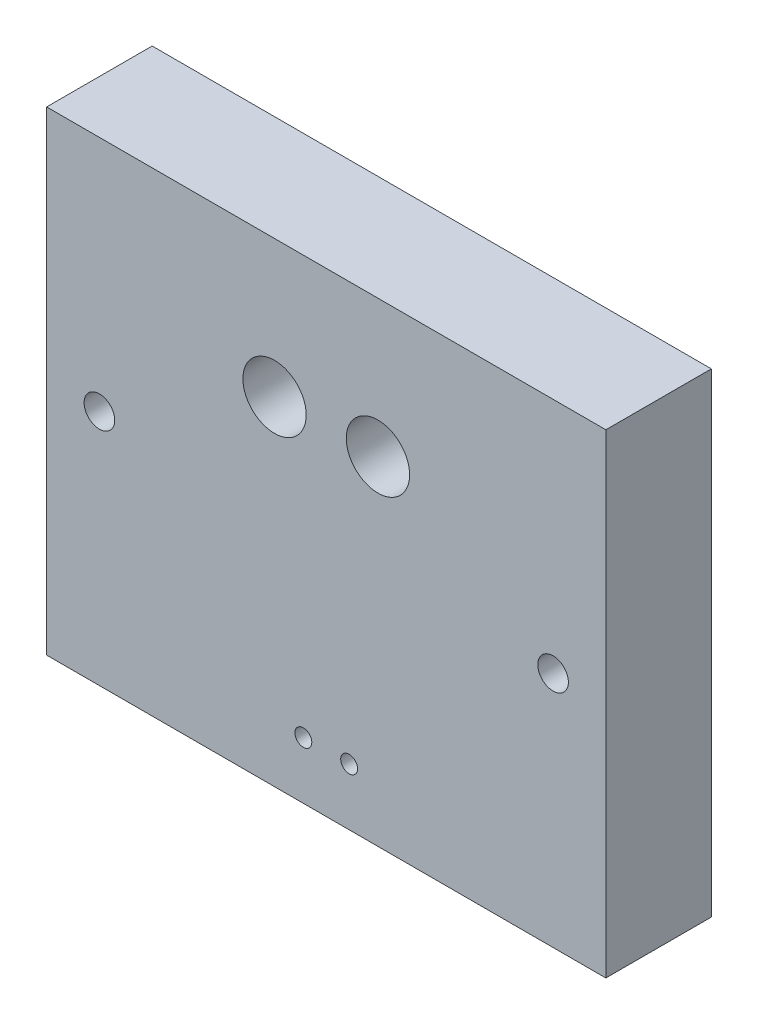
ISO-10303-21;
HEADER;
FILE_DESCRIPTION(('STEP AP214'),'2;1');
FILE_NAME('part.step','',(''),(''),'','','');
FILE_SCHEMA(('AUTOMOTIVE_DESIGN { 1 0 10303 214 1 1 1 1 }'));
ENDSEC;
DATA;
#1=APPLICATION_CONTEXT('core data for automotive mechanical design processes');
#2=APPLICATION_PROTOCOL_DEFINITION('international standard','automotive_design',2000,#1);
#3=PRODUCT_CONTEXT('',#1,'mechanical');
#4=PRODUCT('Part','Part','',(#3));
#5=PRODUCT_RELATED_PRODUCT_CATEGORY('part','',(#4));
#6=PRODUCT_DEFINITION_FORMATION('','',#4);
#7=PRODUCT_DEFINITION_CONTEXT('part definition',#1,'design');
#8=PRODUCT_DEFINITION('design','',#6,#7);
#9=PRODUCT_DEFINITION_SHAPE('','',#8);
#10=(LENGTH_UNIT() NAMED_UNIT(*) SI_UNIT(.MILLI.,.METRE.));
#11=(NAMED_UNIT(*) PLANE_ANGLE_UNIT() SI_UNIT($,.RADIAN.));
#12=(NAMED_UNIT(*) SI_UNIT($,.STERADIAN.) SOLID_ANGLE_UNIT());
#13=UNCERTAINTY_MEASURE_WITH_UNIT(LENGTH_MEASURE(1.E-05),#10,'distance_accuracy_value','');
#14=(GEOMETRIC_REPRESENTATION_CONTEXT(3) GLOBAL_UNCERTAINTY_ASSIGNED_CONTEXT((#13)) GLOBAL_UNIT_ASSIGNED_CONTEXT((#10,
#11,#12)) REPRESENTATION_CONTEXT('',''));
#15=CARTESIAN_POINT('',(0.,0.,0.));
#16=DIRECTION('',(0.,0.,1.));
#17=DIRECTION('',(1.,0.,0.));
#18=AXIS2_PLACEMENT_3D('',#15,#16,#17);
#19=CARTESIAN_POINT('',(3.55665672712301,6.70116618075802,0.));
#20=DIRECTION('',(0.,0.,1.));
#21=DIRECTION('',(1.,0.,0.));
#22=AXIS2_PLACEMENT_3D('',#19,#20,#21);
#23=CYLINDRICAL_SURFACE('',#22,1.45);
#24=CARTESIAN_POINT('',(3.55665672712301,6.70116618075802,0.));
#25=DIRECTION('',(0.,0.,1.));
#26=DIRECTION('',(1.,0.,0.));
#27=AXIS2_PLACEMENT_3D('',#24,#25,#26);
#28=CIRCLE('',#27,1.45);
#29=CARTESIAN_POINT('',(5.00665672712301,6.70116618075802,0.));
#30=VERTEX_POINT('',#29);
#31=EDGE_CURVE('E140',#30,#30,#28,.T.);
#32=ORIENTED_EDGE('',*,*,#31,.F.);
#33=EDGE_LOOP('',(#32));
#34=FACE_BOUND('',#33,.T.);
#35=CARTESIAN_POINT('',(3.55665672712301,6.70116618075802,5.));
#36=DIRECTION('',(0.,0.,1.));
#37=DIRECTION('',(1.,0.,0.));
#38=AXIS2_PLACEMENT_3D('',#35,#36,#37);
#39=CIRCLE('',#38,1.45);
#40=CARTESIAN_POINT('',(5.00665672712301,6.70116618075802,5.));
#41=VERTEX_POINT('',#40);
#42=EDGE_CURVE('E49',#41,#41,#39,.F.);
#43=ORIENTED_EDGE('',*,*,#42,.F.);
#44=EDGE_LOOP('',(#43));
#45=FACE_BOUND('',#44,.T.);
#46=ADVANCED_FACE('F45',(#34,#45),#23,.F.);
#47=CARTESIAN_POINT('',(13.356656727123,6.70116618075802,0.));
#48=DIRECTION('',(0.,0.,1.));
#49=DIRECTION('',(1.,0.,0.));
#50=AXIS2_PLACEMENT_3D('',#47,#48,#49);
#51=CYLINDRICAL_SURFACE('',#50,1.45);
#52=CARTESIAN_POINT('',(13.356656727123,6.70116618075802,0.));
#53=DIRECTION('',(0.,0.,1.));
#54=DIRECTION('',(1.,0.,0.));
#55=AXIS2_PLACEMENT_3D('',#52,#53,#54);
#56=CIRCLE('',#55,1.45);
#57=CARTESIAN_POINT('',(14.806656727123,6.70116618075802,0.));
#58=VERTEX_POINT('',#57);
#59=EDGE_CURVE('E162',#58,#58,#56,.T.);
#60=ORIENTED_EDGE('',*,*,#59,.F.);
#61=EDGE_LOOP('',(#60));
#62=FACE_BOUND('',#61,.T.);
#63=CARTESIAN_POINT('',(13.356656727123,6.70116618075802,5.));
#64=DIRECTION('',(0.,0.,1.));
#65=DIRECTION('',(1.,0.,0.));
#66=AXIS2_PLACEMENT_3D('',#63,#64,#65);
#67=CIRCLE('',#66,1.45);
#68=CARTESIAN_POINT('',(14.806656727123,6.70116618075802,5.));
#69=VERTEX_POINT('',#68);
#70=EDGE_CURVE('E131',#69,#69,#67,.F.);
#71=ORIENTED_EDGE('',*,*,#70,.F.);
#72=EDGE_LOOP('',(#71));
#73=FACE_BOUND('',#72,.T.);
#74=ADVANCED_FACE('F211',(#62,#73),#51,.F.);
#75=CARTESIAN_POINT('',(-18.043343272877,-25.298833819242,10.));
#76=DIRECTION('',(1.,0.,0.));
#77=DIRECTION('',(0.,0.,-1.));
#78=AXIS2_PLACEMENT_3D('',#75,#76,#77);
#79=PLANE('',#78);
#80=DIRECTION('',(0.,-1.,0.));
#81=VECTOR('',#80,1.);
#82=CARTESIAN_POINT('',(-18.043343272877,-25.298833819242,0.));
#83=LINE('',#82,#81);
#84=CARTESIAN_POINT('',(-18.043343272877,19.701166180758,0.));
#85=VERTEX_POINT('',#84);
#86=CARTESIAN_POINT('',(-18.043343272877,-25.298833819242,0.));
#87=VERTEX_POINT('',#86);
#88=EDGE_CURVE('E117',#85,#87,#83,.T.);
#89=ORIENTED_EDGE('',*,*,#88,.T.);
#90=DIRECTION('',(0.,0.,-1.));
#91=VECTOR('',#90,1.);
#92=CARTESIAN_POINT('',(-18.043343272877,-25.298833819242,10.));
#93=LINE('',#92,#91);
#94=CARTESIAN_POINT('',(-18.043343272877,-25.298833819242,10.));
#95=VERTEX_POINT('',#94);
#96=EDGE_CURVE('E11',#95,#87,#93,.T.);
#97=ORIENTED_EDGE('',*,*,#96,.F.);
#98=DIRECTION('',(0.,-1.,0.));
#99=VECTOR('',#98,1.);
#100=CARTESIAN_POINT('',(-18.043343272877,-25.298833819242,10.));
#101=LINE('',#100,#99);
#102=CARTESIAN_POINT('',(-18.043343272877,19.701166180758,10.));
#103=VERTEX_POINT('',#102);
#104=EDGE_CURVE('E100',#103,#95,#101,.T.);
#105=ORIENTED_EDGE('',*,*,#104,.F.);
#106=DIRECTION('',(0.,0.,-1.));
#107=VECTOR('',#106,1.);
#108=CARTESIAN_POINT('',(-18.043343272877,19.701166180758,10.));
#109=LINE('',#108,#107);
#110=EDGE_CURVE('E113',#103,#85,#109,.T.);
#111=ORIENTED_EDGE('',*,*,#110,.T.);
#112=EDGE_LOOP('',(#89,#97,#105,#111));
#113=FACE_BOUND('',#112,.T.);
#114=ADVANCED_FACE('F47',(#113),#79,.F.);
#115=CARTESIAN_POINT('',(-18.043343272877,-25.298833819242,10.));
#116=DIRECTION('',(0.,1.,0.));
#117=DIRECTION('',(0.,0.,1.));
#118=AXIS2_PLACEMENT_3D('',#115,#116,#117);
#119=PLANE('',#118);
#120=DIRECTION('',(1.,0.,0.));
#121=VECTOR('',#120,1.);
#122=CARTESIAN_POINT('',(-18.043343272877,-25.298833819242,0.));
#123=LINE('',#122,#121);
#124=CARTESIAN_POINT('',(34.956656727123,-25.298833819242,0.));
#125=VERTEX_POINT('',#124);
#126=EDGE_CURVE('E105',#87,#125,#123,.T.);
#127=ORIENTED_EDGE('',*,*,#126,.T.);
#128=DIRECTION('',(0.,0.,-1.));
#129=VECTOR('',#128,1.);
#130=CARTESIAN_POINT('',(34.956656727123,-25.298833819242,10.));
#131=LINE('',#130,#129);
#132=CARTESIAN_POINT('',(34.956656727123,-25.298833819242,10.));
#133=VERTEX_POINT('',#132);
#134=EDGE_CURVE('E56',#133,#125,#131,.T.);
#135=ORIENTED_EDGE('',*,*,#134,.F.);
#136=DIRECTION('',(1.,0.,0.));
#137=VECTOR('',#136,1.);
#138=CARTESIAN_POINT('',(-18.043343272877,-25.298833819242,10.));
#139=LINE('',#138,#137);
#140=EDGE_CURVE('E95',#95,#133,#139,.T.);
#141=ORIENTED_EDGE('',*,*,#140,.F.);
#142=ORIENTED_EDGE('',*,*,#96,.T.);
#143=EDGE_LOOP('',(#127,#135,#141,#142));
#144=FACE_BOUND('',#143,.T.);
#145=ADVANCED_FACE('F104',(#144),#119,.F.);
#146=CARTESIAN_POINT('',(34.956656727123,-25.298833819242,10.));
#147=DIRECTION('',(-1.,0.,0.));
#148=DIRECTION('',(0.,-1.,0.));
#149=AXIS2_PLACEMENT_3D('',#146,#147,#148);
#150=PLANE('',#149);
#151=DIRECTION('',(0.,1.,0.));
#152=VECTOR('',#151,1.);
#153=CARTESIAN_POINT('',(34.956656727123,-25.298833819242,0.));
#154=LINE('',#153,#152);
#155=CARTESIAN_POINT('',(34.956656727123,19.701166180758,0.));
#156=VERTEX_POINT('',#155);
#157=EDGE_CURVE('E82',#125,#156,#154,.T.);
#158=ORIENTED_EDGE('',*,*,#157,.T.);
#159=DIRECTION('',(0.,0.,-1.));
#160=VECTOR('',#159,1.);
#161=CARTESIAN_POINT('',(34.956656727123,19.701166180758,10.));
#162=LINE('',#161,#160);
#163=CARTESIAN_POINT('',(34.956656727123,19.701166180758,10.));
#164=VERTEX_POINT('',#163);
#165=EDGE_CURVE('E107',#164,#156,#162,.T.);
#166=ORIENTED_EDGE('',*,*,#165,.F.);
#167=DIRECTION('',(0.,1.,0.));
#168=VECTOR('',#167,1.);
#169=CARTESIAN_POINT('',(34.956656727123,-25.298833819242,10.));
#170=LINE('',#169,#168);
#171=EDGE_CURVE('E98',#133,#164,#170,.T.);
#172=ORIENTED_EDGE('',*,*,#171,.F.);
#173=ORIENTED_EDGE('',*,*,#134,.T.);
#174=EDGE_LOOP('',(#158,#166,#172,#173));
#175=FACE_BOUND('',#174,.T.);
#176=ADVANCED_FACE('F109',(#175),#150,.F.);
#177=CARTESIAN_POINT('',(-18.043343272877,19.701166180758,10.));
#178=DIRECTION('',(0.,-1.,0.));
#179=DIRECTION('',(0.,0.,-1.));
#180=AXIS2_PLACEMENT_3D('',#177,#178,#179);
#181=PLANE('',#180);
#182=DIRECTION('',(-1.,0.,0.));
#183=VECTOR('',#182,1.);
#184=CARTESIAN_POINT('',(-18.043343272877,19.701166180758,0.));
#185=LINE('',#184,#183);
#186=EDGE_CURVE('E88',#156,#85,#185,.T.);
#187=ORIENTED_EDGE('',*,*,#186,.T.);
#188=ORIENTED_EDGE('',*,*,#110,.F.);
#189=DIRECTION('',(-1.,0.,0.));
#190=VECTOR('',#189,1.);
#191=CARTESIAN_POINT('',(-18.043343272877,19.701166180758,10.));
#192=LINE('',#191,#190);
#193=EDGE_CURVE('E65',#164,#103,#192,.T.);
#194=ORIENTED_EDGE('',*,*,#193,.F.);
#195=ORIENTED_EDGE('',*,*,#165,.T.);
#196=EDGE_LOOP('',(#187,#188,#194,#195));
#197=FACE_BOUND('',#196,.T.);
#198=ADVANCED_FACE('F197',(#197),#181,.F.);
#199=CARTESIAN_POINT('',(0.,0.,10.));
#200=DIRECTION('',(0.,0.,-1.));
#201=DIRECTION('',(-1.,0.,0.));
#202=AXIS2_PLACEMENT_3D('',#199,#200,#201);
#203=PLANE('',#202);
#204=CARTESIAN_POINT('',(-13.043343272877,-2.79883381924197,10.));
#205=DIRECTION('',(0.,0.,1.));
#206=DIRECTION('',(1.,0.,0.));
#207=AXIS2_PLACEMENT_3D('',#204,#205,#206);
#208=CIRCLE('',#207,1.45);
#209=CARTESIAN_POINT('',(-11.593343272877,-2.79883381924197,10.));
#210=VERTEX_POINT('',#209);
#211=EDGE_CURVE('E261',#210,#210,#208,.T.);
#212=ORIENTED_EDGE('',*,*,#211,.F.);
#213=EDGE_LOOP('',(#212));
#214=FACE_BOUND('',#213,.T.);
#215=CARTESIAN_POINT('',(29.956656727123,-2.79883381924198,10.));
#216=DIRECTION('',(0.,0.,1.));
#217=DIRECTION('',(-1.,0.,0.));
#218=AXIS2_PLACEMENT_3D('',#215,#216,#217);
#219=CIRCLE('',#218,1.45);
#220=CARTESIAN_POINT('',(28.506656727123,-2.79883381924198,10.));
#221=VERTEX_POINT('',#220);
#222=EDGE_CURVE('E263',#221,#221,#219,.T.);
#223=ORIENTED_EDGE('',*,*,#222,.F.);
#224=EDGE_LOOP('',(#223));
#225=FACE_BOUND('',#224,.T.);
#226=CARTESIAN_POINT('',(3.55665672712301,6.70116618075802,10.));
#227=DIRECTION('',(0.,0.,1.));
#228=DIRECTION('',(1.,0.,0.));
#229=AXIS2_PLACEMENT_3D('',#226,#227,#228);
#230=CIRCLE('',#229,3.);
#231=CARTESIAN_POINT('',(6.55665672712301,6.70116618075802,10.));
#232=VERTEX_POINT('',#231);
#233=EDGE_CURVE('E142',#232,#232,#230,.T.);
#234=ORIENTED_EDGE('',*,*,#233,.F.);
#235=EDGE_LOOP('',(#234));
#236=FACE_BOUND('',#235,.T.);
#237=CARTESIAN_POINT('',(13.356656727123,6.70116618075802,10.));
#238=DIRECTION('',(0.,0.,1.));
#239=DIRECTION('',(1.,0.,0.));
#240=AXIS2_PLACEMENT_3D('',#237,#238,#239);
#241=CIRCLE('',#240,3.);
#242=CARTESIAN_POINT('',(16.356656727123,6.70116618075802,10.));
#243=VERTEX_POINT('',#242);
#244=EDGE_CURVE('E148',#243,#243,#241,.T.);
#245=ORIENTED_EDGE('',*,*,#244,.F.);
#246=EDGE_LOOP('',(#245));
#247=FACE_BOUND('',#246,.T.);
#248=CARTESIAN_POINT('',(6.286656727123,-19.898833819242,10.));
#249=DIRECTION('',(0.,0.,1.));
#250=DIRECTION('',(1.,0.,0.));
#251=AXIS2_PLACEMENT_3D('',#248,#249,#250);
#252=CIRCLE('',#251,0.8);
#253=CARTESIAN_POINT('',(7.086656727123,-19.898833819242,10.));
#254=VERTEX_POINT('',#253);
#255=EDGE_CURVE('E173',#254,#254,#252,.T.);
#256=ORIENTED_EDGE('',*,*,#255,.F.);
#257=EDGE_LOOP('',(#256));
#258=FACE_BOUND('',#257,.T.);
#259=CARTESIAN_POINT('',(10.626656727123,-19.898833819242,10.));
#260=DIRECTION('',(0.,0.,1.));
#261=DIRECTION('',(1.,0.,0.));
#262=AXIS2_PLACEMENT_3D('',#259,#260,#261);
#263=CIRCLE('',#262,0.8);
#264=CARTESIAN_POINT('',(11.426656727123,-19.898833819242,10.));
#265=VERTEX_POINT('',#264);
#266=EDGE_CURVE('E177',#265,#265,#263,.T.);
#267=ORIENTED_EDGE('',*,*,#266,.F.);
#268=EDGE_LOOP('',(#267));
#269=FACE_BOUND('',#268,.T.);
#270=ORIENTED_EDGE('',*,*,#104,.T.);
#271=ORIENTED_EDGE('',*,*,#140,.T.);
#272=ORIENTED_EDGE('',*,*,#171,.T.);
#273=ORIENTED_EDGE('',*,*,#193,.T.);
#274=EDGE_LOOP('',(#270,#271,#272,#273));
#275=FACE_BOUND('',#274,.T.);
#276=ADVANCED_FACE('F96',(#214,#225,#236,#247,#258,#269,#275),#203,.F.);
#277=CARTESIAN_POINT('',(0.,0.,0.));
#278=DIRECTION('',(0.,0.,-1.));
#279=DIRECTION('',(-1.,0.,0.));
#280=AXIS2_PLACEMENT_3D('',#277,#278,#279);
#281=PLANE('',#280);
#282=CARTESIAN_POINT('',(-13.043343272877,-2.79883381924197,0.));
#283=DIRECTION('',(0.,0.,1.));
#284=DIRECTION('',(1.,0.,0.));
#285=AXIS2_PLACEMENT_3D('',#282,#283,#284);
#286=CIRCLE('',#285,1.45);
#287=CARTESIAN_POINT('',(-11.593343272877,-2.79883381924197,0.));
#288=VERTEX_POINT('',#287);
#289=EDGE_CURVE('E161',#288,#288,#286,.T.);
#290=ORIENTED_EDGE('',*,*,#289,.T.);
#291=EDGE_LOOP('',(#290));
#292=FACE_BOUND('',#291,.T.);
#293=CARTESIAN_POINT('',(29.956656727123,-2.79883381924198,0.));
#294=DIRECTION('',(0.,0.,1.));
#295=DIRECTION('',(-1.,0.,0.));
#296=AXIS2_PLACEMENT_3D('',#293,#294,#295);
#297=CIRCLE('',#296,1.45);
#298=CARTESIAN_POINT('',(28.506656727123,-2.79883381924198,0.));
#299=VERTEX_POINT('',#298);
#300=EDGE_CURVE('E151',#299,#299,#297,.T.);
#301=ORIENTED_EDGE('',*,*,#300,.T.);
#302=EDGE_LOOP('',(#301));
#303=FACE_BOUND('',#302,.T.);
#304=ORIENTED_EDGE('',*,*,#59,.T.);
#305=EDGE_LOOP('',(#304));
#306=FACE_BOUND('',#305,.T.);
#307=ORIENTED_EDGE('',*,*,#31,.T.);
#308=EDGE_LOOP('',(#307));
#309=FACE_BOUND('',#308,.T.);
#310=CARTESIAN_POINT('',(6.286656727123,-19.898833819242,0.));
#311=DIRECTION('',(0.,0.,1.));
#312=DIRECTION('',(1.,0.,0.));
#313=AXIS2_PLACEMENT_3D('',#310,#311,#312);
#314=CIRCLE('',#313,0.8);
#315=CARTESIAN_POINT('',(7.086656727123,-19.898833819242,0.));
#316=VERTEX_POINT('',#315);
#317=EDGE_CURVE('E121',#316,#316,#314,.T.);
#318=ORIENTED_EDGE('',*,*,#317,.T.);
#319=EDGE_LOOP('',(#318));
#320=FACE_BOUND('',#319,.T.);
#321=CARTESIAN_POINT('',(10.626656727123,-19.898833819242,0.));
#322=DIRECTION('',(0.,0.,1.));
#323=DIRECTION('',(1.,0.,0.));
#324=AXIS2_PLACEMENT_3D('',#321,#322,#323);
#325=CIRCLE('',#324,0.8);
#326=CARTESIAN_POINT('',(11.426656727123,-19.898833819242,0.));
#327=VERTEX_POINT('',#326);
#328=EDGE_CURVE('E166',#327,#327,#325,.T.);
#329=ORIENTED_EDGE('',*,*,#328,.T.);
#330=EDGE_LOOP('',(#329));
#331=FACE_BOUND('',#330,.T.);
#332=ORIENTED_EDGE('',*,*,#88,.F.);
#333=ORIENTED_EDGE('',*,*,#186,.F.);
#334=ORIENTED_EDGE('',*,*,#157,.F.);
#335=ORIENTED_EDGE('',*,*,#126,.F.);
#336=EDGE_LOOP('',(#332,#333,#334,#335));
#337=FACE_BOUND('',#336,.T.);
#338=ADVANCED_FACE('F186',(#292,#303,#306,#309,#320,#331,#337),#281,.T.);
#339=CARTESIAN_POINT('',(10.626656727123,-19.898833819242,0.));
#340=DIRECTION('',(0.,0.,1.));
#341=DIRECTION('',(1.,0.,0.));
#342=AXIS2_PLACEMENT_3D('',#339,#340,#341);
#343=CYLINDRICAL_SURFACE('',#342,0.8);
#344=ORIENTED_EDGE('',*,*,#328,.F.);
#345=EDGE_LOOP('',(#344));
#346=FACE_BOUND('',#345,.T.);
#347=ORIENTED_EDGE('',*,*,#266,.T.);
#348=EDGE_LOOP('',(#347));
#349=FACE_BOUND('',#348,.T.);
#350=ADVANCED_FACE('F189',(#346,#349),#343,.F.);
#351=CARTESIAN_POINT('',(6.286656727123,-19.898833819242,0.));
#352=DIRECTION('',(0.,0.,1.));
#353=DIRECTION('',(1.,0.,0.));
#354=AXIS2_PLACEMENT_3D('',#351,#352,#353);
#355=CYLINDRICAL_SURFACE('',#354,0.8);
#356=ORIENTED_EDGE('',*,*,#317,.F.);
#357=EDGE_LOOP('',(#356));
#358=FACE_BOUND('',#357,.T.);
#359=ORIENTED_EDGE('',*,*,#255,.T.);
#360=EDGE_LOOP('',(#359));
#361=FACE_BOUND('',#360,.T.);
#362=ADVANCED_FACE('F192',(#358,#361),#355,.F.);
#363=CARTESIAN_POINT('',(13.356656727123,6.70116618075802,5.));
#364=DIRECTION('',(0.,0.,1.));
#365=DIRECTION('',(1.,0.,0.));
#366=AXIS2_PLACEMENT_3D('',#363,#364,#365);
#367=PLANE('',#366);
#368=CARTESIAN_POINT('',(13.356656727123,6.70116618075802,5.));
#369=DIRECTION('',(0.,0.,1.));
#370=DIRECTION('',(1.,0.,0.));
#371=AXIS2_PLACEMENT_3D('',#368,#369,#370);
#372=CIRCLE('',#371,3.);
#373=CARTESIAN_POINT('',(16.356656727123,6.70116618075802,5.));
#374=VERTEX_POINT('',#373);
#375=EDGE_CURVE('E157',#374,#374,#372,.T.);
#376=ORIENTED_EDGE('',*,*,#375,.T.);
#377=EDGE_LOOP('',(#376));
#378=FACE_BOUND('',#377,.T.);
#379=ORIENTED_EDGE('',*,*,#70,.T.);
#380=EDGE_LOOP('',(#379));
#381=FACE_BOUND('',#380,.T.);
#382=ADVANCED_FACE('F224',(#378,#381),#367,.T.);
#383=CARTESIAN_POINT('',(13.356656727123,6.70116618075802,5.));
#384=DIRECTION('',(0.,0.,1.));
#385=DIRECTION('',(1.,0.,0.));
#386=AXIS2_PLACEMENT_3D('',#383,#384,#385);
#387=CYLINDRICAL_SURFACE('',#386,3.);
#388=ORIENTED_EDGE('',*,*,#375,.F.);
#389=EDGE_LOOP('',(#388));
#390=FACE_BOUND('',#389,.T.);
#391=ORIENTED_EDGE('',*,*,#244,.T.);
#392=EDGE_LOOP('',(#391));
#393=FACE_BOUND('',#392,.T.);
#394=ADVANCED_FACE('F229',(#390,#393),#387,.F.);
#395=CARTESIAN_POINT('',(3.55665672712301,6.70116618075802,5.));
#396=DIRECTION('',(0.,0.,1.));
#397=DIRECTION('',(1.,0.,0.));
#398=AXIS2_PLACEMENT_3D('',#395,#396,#397);
#399=PLANE('',#398);
#400=CARTESIAN_POINT('',(3.55665672712301,6.70116618075802,5.));
#401=DIRECTION('',(0.,0.,1.));
#402=DIRECTION('',(1.,0.,0.));
#403=AXIS2_PLACEMENT_3D('',#400,#401,#402);
#404=CIRCLE('',#403,3.);
#405=CARTESIAN_POINT('',(6.55665672712301,6.70116618075802,5.));
#406=VERTEX_POINT('',#405);
#407=EDGE_CURVE('E134',#406,#406,#404,.T.);
#408=ORIENTED_EDGE('',*,*,#407,.T.);
#409=EDGE_LOOP('',(#408));
#410=FACE_BOUND('',#409,.T.);
#411=ORIENTED_EDGE('',*,*,#42,.T.);
#412=EDGE_LOOP('',(#411));
#413=FACE_BOUND('',#412,.T.);
#414=ADVANCED_FACE('F239',(#410,#413),#399,.T.);
#415=CARTESIAN_POINT('',(3.55665672712301,6.70116618075802,5.));
#416=DIRECTION('',(0.,0.,1.));
#417=DIRECTION('',(1.,0.,0.));
#418=AXIS2_PLACEMENT_3D('',#415,#416,#417);
#419=CYLINDRICAL_SURFACE('',#418,3.);
#420=ORIENTED_EDGE('',*,*,#407,.F.);
#421=EDGE_LOOP('',(#420));
#422=FACE_BOUND('',#421,.T.);
#423=ORIENTED_EDGE('',*,*,#233,.T.);
#424=EDGE_LOOP('',(#423));
#425=FACE_BOUND('',#424,.T.);
#426=ADVANCED_FACE('F243',(#422,#425),#419,.F.);
#427=CARTESIAN_POINT('',(29.956656727123,-2.79883381924198,0.));
#428=DIRECTION('',(0.,0.,1.));
#429=DIRECTION('',(1.,0.,0.));
#430=AXIS2_PLACEMENT_3D('',#427,#428,#429);
#431=CYLINDRICAL_SURFACE('',#430,1.45);
#432=ORIENTED_EDGE('',*,*,#300,.F.);
#433=EDGE_LOOP('',(#432));
#434=FACE_BOUND('',#433,.T.);
#435=ORIENTED_EDGE('',*,*,#222,.T.);
#436=EDGE_LOOP('',(#435));
#437=FACE_BOUND('',#436,.T.);
#438=ADVANCED_FACE('F245',(#434,#437),#431,.F.);
#439=CARTESIAN_POINT('',(-13.043343272877,-2.79883381924197,0.));
#440=DIRECTION('',(0.,0.,1.));
#441=DIRECTION('',(1.,0.,0.));
#442=AXIS2_PLACEMENT_3D('',#439,#440,#441);
#443=CYLINDRICAL_SURFACE('',#442,1.45);
#444=ORIENTED_EDGE('',*,*,#289,.F.);
#445=EDGE_LOOP('',(#444));
#446=FACE_BOUND('',#445,.T.);
#447=ORIENTED_EDGE('',*,*,#211,.T.);
#448=EDGE_LOOP('',(#447));
#449=FACE_BOUND('',#448,.T.);
#450=ADVANCED_FACE('F251',(#446,#449),#443,.F.);
#451=CLOSED_SHELL('',(#46,#74,#114,#145,#176,#198,#276,#338,#350,#362,#382,#394,#414,#426,#438,#450));
#452=MANIFOLD_SOLID_BREP('B2',#451);
#453=ADVANCED_BREP_SHAPE_REPRESENTATION('',(#18,#452),#14);
#454=SHAPE_DEFINITION_REPRESENTATION(#9,#453);
ENDSEC;
END-ISO-10303-21;
